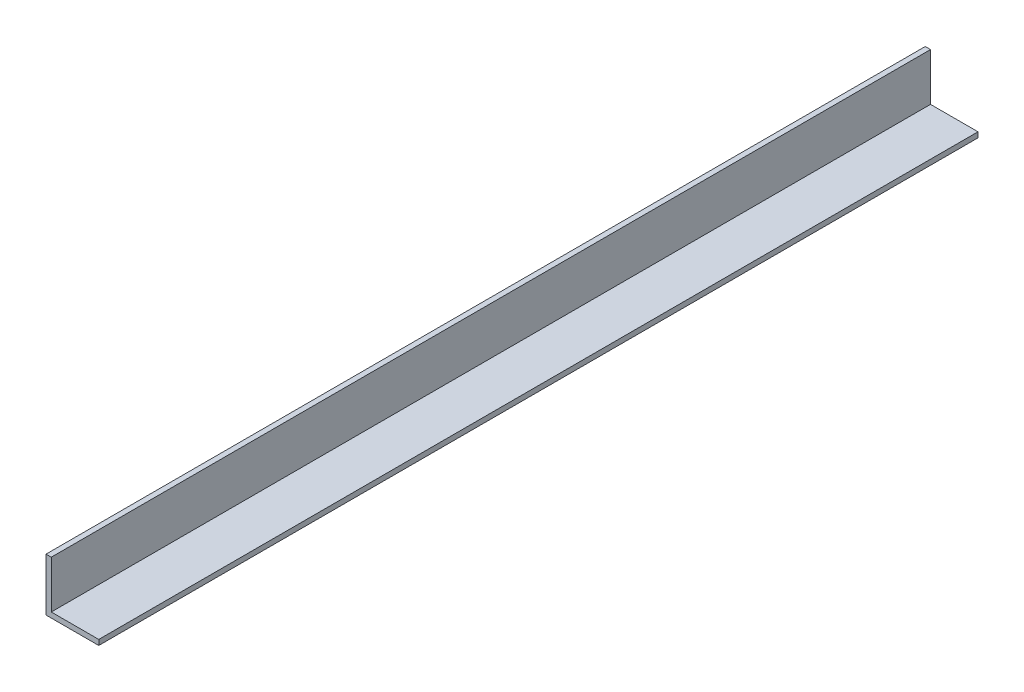
ISO-10303-21;
HEADER;
FILE_DESCRIPTION(('STEP AP214'),'2;1');
FILE_NAME('part.step','',(''),(''),'','','');
FILE_SCHEMA(('AUTOMOTIVE_DESIGN { 1 0 10303 214 1 1 1 1 }'));
ENDSEC;
DATA;
#1=APPLICATION_CONTEXT('core data for automotive mechanical design processes');
#2=APPLICATION_PROTOCOL_DEFINITION('international standard','automotive_design',2000,#1);
#3=PRODUCT_CONTEXT('',#1,'mechanical');
#4=PRODUCT('Part','Part','',(#3));
#5=PRODUCT_RELATED_PRODUCT_CATEGORY('part','',(#4));
#6=PRODUCT_DEFINITION_FORMATION('','',#4);
#7=PRODUCT_DEFINITION_CONTEXT('part definition',#1,'design');
#8=PRODUCT_DEFINITION('design','',#6,#7);
#9=PRODUCT_DEFINITION_SHAPE('','',#8);
#10=(LENGTH_UNIT() NAMED_UNIT(*) SI_UNIT(.MILLI.,.METRE.));
#11=(NAMED_UNIT(*) PLANE_ANGLE_UNIT() SI_UNIT($,.RADIAN.));
#12=(NAMED_UNIT(*) SI_UNIT($,.STERADIAN.) SOLID_ANGLE_UNIT());
#13=UNCERTAINTY_MEASURE_WITH_UNIT(LENGTH_MEASURE(1.E-05),#10,'distance_accuracy_value','');
#14=(GEOMETRIC_REPRESENTATION_CONTEXT(3) GLOBAL_UNCERTAINTY_ASSIGNED_CONTEXT((#13)) GLOBAL_UNIT_ASSIGNED_CONTEXT((#10,
#11,#12)) REPRESENTATION_CONTEXT('',''));
#15=CARTESIAN_POINT('',(0.,0.,0.));
#16=DIRECTION('',(0.,0.,1.));
#17=DIRECTION('',(1.,0.,0.));
#18=AXIS2_PLACEMENT_3D('',#15,#16,#17);
#19=CARTESIAN_POINT('',(27.,0.,500.));
#20=DIRECTION('',(0.,-1.,0.));
#21=DIRECTION('',(0.,0.,-1.));
#22=AXIS2_PLACEMENT_3D('',#19,#20,#21);
#23=PLANE('',#22);
#24=DIRECTION('',(-1.,0.,0.));
#25=VECTOR('',#24,1.);
#26=CARTESIAN_POINT('',(27.,0.,0.));
#27=LINE('',#26,#25);
#28=CARTESIAN_POINT('',(27.,0.,0.));
#29=VERTEX_POINT('',#28);
#30=CARTESIAN_POINT('',(0.,0.,0.));
#31=VERTEX_POINT('',#30);
#32=EDGE_CURVE('E128',#29,#31,#27,.T.);
#33=ORIENTED_EDGE('',*,*,#32,.T.);
#34=DIRECTION('',(0.,0.,-1.));
#35=VECTOR('',#34,1.);
#36=CARTESIAN_POINT('',(0.,0.,500.));
#37=LINE('',#36,#35);
#38=CARTESIAN_POINT('',(0.,0.,500.));
#39=VERTEX_POINT('',#38);
#40=EDGE_CURVE('E11',#39,#31,#37,.T.);
#41=ORIENTED_EDGE('',*,*,#40,.F.);
#42=DIRECTION('',(-1.,0.,0.));
#43=VECTOR('',#42,1.);
#44=CARTESIAN_POINT('',(27.,0.,500.));
#45=LINE('',#44,#43);
#46=CARTESIAN_POINT('',(27.,0.,500.));
#47=VERTEX_POINT('',#46);
#48=EDGE_CURVE('E144',#47,#39,#45,.T.);
#49=ORIENTED_EDGE('',*,*,#48,.F.);
#50=DIRECTION('',(0.,0.,-1.));
#51=VECTOR('',#50,1.);
#52=CARTESIAN_POINT('',(27.,0.,500.));
#53=LINE('',#52,#51);
#54=EDGE_CURVE('E124',#47,#29,#53,.T.);
#55=ORIENTED_EDGE('',*,*,#54,.T.);
#56=EDGE_LOOP('',(#33,#41,#49,#55));
#57=FACE_BOUND('',#56,.T.);
#58=ADVANCED_FACE('F39',(#57),#23,.F.);
#59=CARTESIAN_POINT('',(0.,0.,500.));
#60=DIRECTION('',(-1.,0.,0.));
#61=DIRECTION('',(0.,0.,1.));
#62=AXIS2_PLACEMENT_3D('',#59,#60,#61);
#63=PLANE('',#62);
#64=DIRECTION('',(0.,1.,0.));
#65=VECTOR('',#64,1.);
#66=CARTESIAN_POINT('',(0.,0.,0.));
#67=LINE('',#66,#65);
#68=CARTESIAN_POINT('',(0.,27.,0.));
#69=VERTEX_POINT('',#68);
#70=EDGE_CURVE('E132',#31,#69,#67,.T.);
#71=ORIENTED_EDGE('',*,*,#70,.T.);
#72=DIRECTION('',(0.,0.,-1.));
#73=VECTOR('',#72,1.);
#74=CARTESIAN_POINT('',(0.,27.,500.));
#75=LINE('',#74,#73);
#76=CARTESIAN_POINT('',(0.,27.,500.));
#77=VERTEX_POINT('',#76);
#78=EDGE_CURVE('E48',#77,#69,#75,.T.);
#79=ORIENTED_EDGE('',*,*,#78,.F.);
#80=DIRECTION('',(0.,1.,0.));
#81=VECTOR('',#80,1.);
#82=CARTESIAN_POINT('',(0.,0.,500.));
#83=LINE('',#82,#81);
#84=EDGE_CURVE('E93',#39,#77,#83,.T.);
#85=ORIENTED_EDGE('',*,*,#84,.F.);
#86=ORIENTED_EDGE('',*,*,#40,.T.);
#87=EDGE_LOOP('',(#71,#79,#85,#86));
#88=FACE_BOUND('',#87,.T.);
#89=ADVANCED_FACE('F172',(#88),#63,.F.);
#90=CARTESIAN_POINT('',(0.,27.,500.));
#91=DIRECTION('',(0.,-1.,0.));
#92=DIRECTION('',(0.,0.,-1.));
#93=AXIS2_PLACEMENT_3D('',#90,#91,#92);
#94=PLANE('',#93);
#95=DIRECTION('',(-1.,0.,0.));
#96=VECTOR('',#95,1.);
#97=CARTESIAN_POINT('',(0.,27.,0.));
#98=LINE('',#97,#96);
#99=CARTESIAN_POINT('',(-3.,27.,0.));
#100=VERTEX_POINT('',#99);
#101=EDGE_CURVE('E135',#69,#100,#98,.T.);
#102=ORIENTED_EDGE('',*,*,#101,.T.);
#103=DIRECTION('',(0.,0.,-1.));
#104=VECTOR('',#103,1.);
#105=CARTESIAN_POINT('',(-3.,27.,500.));
#106=LINE('',#105,#104);
#107=CARTESIAN_POINT('',(-3.,27.,500.));
#108=VERTEX_POINT('',#107);
#109=EDGE_CURVE('E117',#108,#100,#106,.T.);
#110=ORIENTED_EDGE('',*,*,#109,.F.);
#111=DIRECTION('',(-1.,0.,0.));
#112=VECTOR('',#111,1.);
#113=CARTESIAN_POINT('',(0.,27.,500.));
#114=LINE('',#113,#112);
#115=EDGE_CURVE('E106',#77,#108,#114,.T.);
#116=ORIENTED_EDGE('',*,*,#115,.F.);
#117=ORIENTED_EDGE('',*,*,#78,.T.);
#118=EDGE_LOOP('',(#102,#110,#116,#117));
#119=FACE_BOUND('',#118,.T.);
#120=ADVANCED_FACE('F154',(#119),#94,.F.);
#121=CARTESIAN_POINT('',(-3.,27.,500.));
#122=DIRECTION('',(1.,0.,0.));
#123=DIRECTION('',(0.,0.,-1.));
#124=AXIS2_PLACEMENT_3D('',#121,#122,#123);
#125=PLANE('',#124);
#126=DIRECTION('',(0.,-1.,0.));
#127=VECTOR('',#126,1.);
#128=CARTESIAN_POINT('',(-3.,27.,0.));
#129=LINE('',#128,#127);
#130=CARTESIAN_POINT('',(-3.,-3.,0.));
#131=VERTEX_POINT('',#130);
#132=EDGE_CURVE('E115',#100,#131,#129,.T.);
#133=ORIENTED_EDGE('',*,*,#132,.T.);
#134=DIRECTION('',(0.,0.,-1.));
#135=VECTOR('',#134,1.);
#136=CARTESIAN_POINT('',(-3.,-3.,500.));
#137=LINE('',#136,#135);
#138=CARTESIAN_POINT('',(-3.,-3.,500.));
#139=VERTEX_POINT('',#138);
#140=EDGE_CURVE('E112',#139,#131,#137,.T.);
#141=ORIENTED_EDGE('',*,*,#140,.F.);
#142=DIRECTION('',(0.,-1.,0.));
#143=VECTOR('',#142,1.);
#144=CARTESIAN_POINT('',(-3.,27.,500.));
#145=LINE('',#144,#143);
#146=EDGE_CURVE('E100',#108,#139,#145,.T.);
#147=ORIENTED_EDGE('',*,*,#146,.F.);
#148=ORIENTED_EDGE('',*,*,#109,.T.);
#149=EDGE_LOOP('',(#133,#141,#147,#148));
#150=FACE_BOUND('',#149,.T.);
#151=ADVANCED_FACE('F113',(#150),#125,.F.);
#152=CARTESIAN_POINT('',(-3.,-3.,500.));
#153=DIRECTION('',(0.,1.,0.));
#154=DIRECTION('',(0.,0.,1.));
#155=AXIS2_PLACEMENT_3D('',#152,#153,#154);
#156=PLANE('',#155);
#157=DIRECTION('',(1.,0.,0.));
#158=VECTOR('',#157,1.);
#159=CARTESIAN_POINT('',(-3.,-3.,0.));
#160=LINE('',#159,#158);
#161=CARTESIAN_POINT('',(27.,-3.,0.));
#162=VERTEX_POINT('',#161);
#163=EDGE_CURVE('E79',#131,#162,#160,.T.);
#164=ORIENTED_EDGE('',*,*,#163,.T.);
#165=DIRECTION('',(0.,0.,-1.));
#166=VECTOR('',#165,1.);
#167=CARTESIAN_POINT('',(27.,-3.,500.));
#168=LINE('',#167,#166);
#169=CARTESIAN_POINT('',(27.,-3.,500.));
#170=VERTEX_POINT('',#169);
#171=EDGE_CURVE('E118',#170,#162,#168,.T.);
#172=ORIENTED_EDGE('',*,*,#171,.F.);
#173=DIRECTION('',(1.,0.,0.));
#174=VECTOR('',#173,1.);
#175=CARTESIAN_POINT('',(-3.,-3.,500.));
#176=LINE('',#175,#174);
#177=EDGE_CURVE('E104',#139,#170,#176,.T.);
#178=ORIENTED_EDGE('',*,*,#177,.F.);
#179=ORIENTED_EDGE('',*,*,#140,.T.);
#180=EDGE_LOOP('',(#164,#172,#178,#179));
#181=FACE_BOUND('',#180,.T.);
#182=ADVANCED_FACE('F120',(#181),#156,.F.);
#183=CARTESIAN_POINT('',(27.,-3.,500.));
#184=DIRECTION('',(-1.,0.,0.));
#185=DIRECTION('',(0.,0.,1.));
#186=AXIS2_PLACEMENT_3D('',#183,#184,#185);
#187=PLANE('',#186);
#188=DIRECTION('',(0.,1.,0.));
#189=VECTOR('',#188,1.);
#190=CARTESIAN_POINT('',(27.,-3.,0.));
#191=LINE('',#190,#189);
#192=EDGE_CURVE('E85',#162,#29,#191,.T.);
#193=ORIENTED_EDGE('',*,*,#192,.T.);
#194=ORIENTED_EDGE('',*,*,#54,.F.);
#195=DIRECTION('',(0.,1.,0.));
#196=VECTOR('',#195,1.);
#197=CARTESIAN_POINT('',(27.,-3.,500.));
#198=LINE('',#197,#196);
#199=EDGE_CURVE('E56',#170,#47,#198,.T.);
#200=ORIENTED_EDGE('',*,*,#199,.F.);
#201=ORIENTED_EDGE('',*,*,#171,.T.);
#202=EDGE_LOOP('',(#193,#194,#200,#201));
#203=FACE_BOUND('',#202,.T.);
#204=ADVANCED_FACE('F161',(#203),#187,.F.);
#205=CARTESIAN_POINT('',(0.,0.,500.));
#206=DIRECTION('',(0.,0.,-1.));
#207=DIRECTION('',(-1.,0.,0.));
#208=AXIS2_PLACEMENT_3D('',#205,#206,#207);
#209=PLANE('',#208);
#210=ORIENTED_EDGE('',*,*,#48,.T.);
#211=ORIENTED_EDGE('',*,*,#84,.T.);
#212=ORIENTED_EDGE('',*,*,#115,.T.);
#213=ORIENTED_EDGE('',*,*,#146,.T.);
#214=ORIENTED_EDGE('',*,*,#177,.T.);
#215=ORIENTED_EDGE('',*,*,#199,.T.);
#216=EDGE_LOOP('',(#210,#211,#212,#213,#214,#215));
#217=FACE_BOUND('',#216,.T.);
#218=ADVANCED_FACE('F102',(#217),#209,.F.);
#219=CARTESIAN_POINT('',(0.,0.,0.));
#220=DIRECTION('',(0.,0.,-1.));
#221=DIRECTION('',(-1.,0.,0.));
#222=AXIS2_PLACEMENT_3D('',#219,#220,#221);
#223=PLANE('',#222);
#224=ORIENTED_EDGE('',*,*,#32,.F.);
#225=ORIENTED_EDGE('',*,*,#192,.F.);
#226=ORIENTED_EDGE('',*,*,#163,.F.);
#227=ORIENTED_EDGE('',*,*,#132,.F.);
#228=ORIENTED_EDGE('',*,*,#101,.F.);
#229=ORIENTED_EDGE('',*,*,#70,.F.);
#230=EDGE_LOOP('',(#224,#225,#226,#227,#228,#229));
#231=FACE_BOUND('',#230,.T.);
#232=ADVANCED_FACE('F157',(#231),#223,.T.);
#233=CLOSED_SHELL('',(#58,#89,#120,#151,#182,#204,#218,#232));
#234=MANIFOLD_SOLID_BREP('B2',#233);
#235=ADVANCED_BREP_SHAPE_REPRESENTATION('',(#18,#234),#14);
#236=SHAPE_DEFINITION_REPRESENTATION(#9,#235);
ENDSEC;
END-ISO-10303-21;
